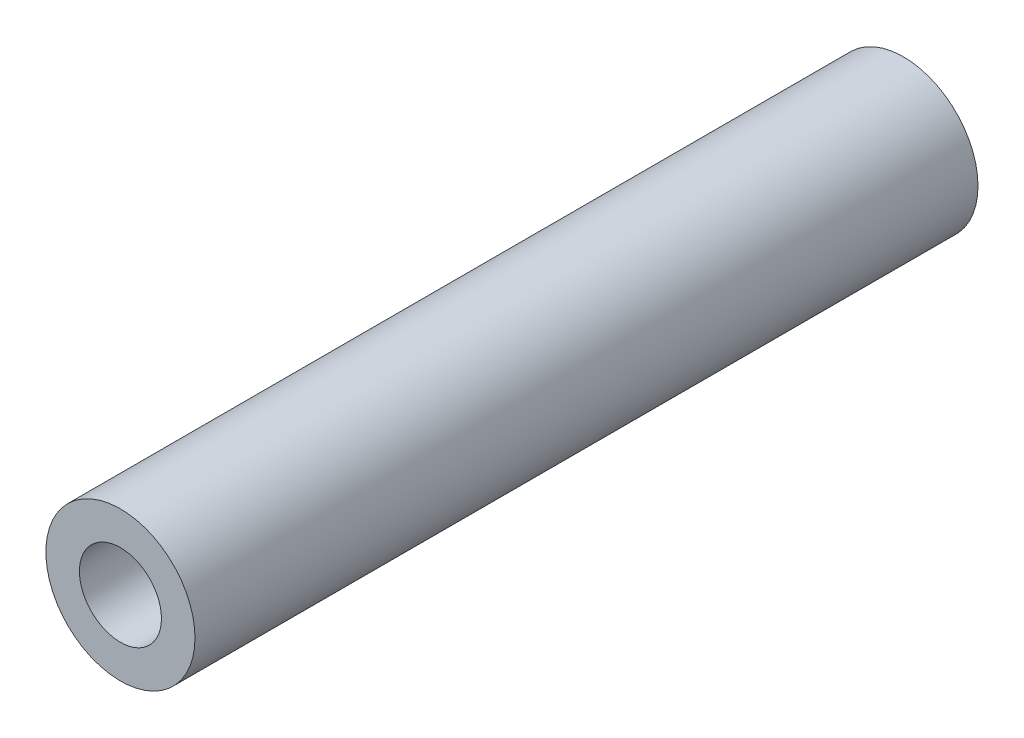
ISO-10303-21;
HEADER;
FILE_DESCRIPTION(('STEP AP214'),'2;1');
FILE_NAME('part.step','',(''),(''),'','','');
FILE_SCHEMA(('AUTOMOTIVE_DESIGN { 1 0 10303 214 1 1 1 1 }'));
ENDSEC;
DATA;
#1=APPLICATION_CONTEXT('core data for automotive mechanical design processes');
#2=APPLICATION_PROTOCOL_DEFINITION('international standard','automotive_design',2000,#1);
#3=PRODUCT_CONTEXT('',#1,'mechanical');
#4=PRODUCT('Part','Part','',(#3));
#5=PRODUCT_RELATED_PRODUCT_CATEGORY('part','',(#4));
#6=PRODUCT_DEFINITION_FORMATION('','',#4);
#7=PRODUCT_DEFINITION_CONTEXT('part definition',#1,'design');
#8=PRODUCT_DEFINITION('design','',#6,#7);
#9=PRODUCT_DEFINITION_SHAPE('','',#8);
#10=(LENGTH_UNIT() NAMED_UNIT(*) SI_UNIT(.MILLI.,.METRE.));
#11=(NAMED_UNIT(*) PLANE_ANGLE_UNIT() SI_UNIT($,.RADIAN.));
#12=(NAMED_UNIT(*) SI_UNIT($,.STERADIAN.) SOLID_ANGLE_UNIT());
#13=UNCERTAINTY_MEASURE_WITH_UNIT(LENGTH_MEASURE(1.E-05),#10,'distance_accuracy_value','');
#14=(GEOMETRIC_REPRESENTATION_CONTEXT(3) GLOBAL_UNCERTAINTY_ASSIGNED_CONTEXT((#13)) GLOBAL_UNIT_ASSIGNED_CONTEXT((#10,
#11,#12)) REPRESENTATION_CONTEXT('',''));
#15=CARTESIAN_POINT('',(0.,0.,0.));
#16=DIRECTION('',(0.,0.,1.));
#17=DIRECTION('',(1.,0.,0.));
#18=AXIS2_PLACEMENT_3D('',#15,#16,#17);
#19=CARTESIAN_POINT('',(0.,0.,31.5));
#20=DIRECTION('',(0.,0.,-1.));
#21=DIRECTION('',(-1.,0.,0.));
#22=AXIS2_PLACEMENT_3D('',#19,#20,#21);
#23=CYLINDRICAL_SURFACE('',#22,3.);
#24=CARTESIAN_POINT('',(0.,0.,31.5));
#25=DIRECTION('',(0.,0.,1.));
#26=DIRECTION('',(1.,0.,0.));
#27=AXIS2_PLACEMENT_3D('',#24,#25,#26);
#28=CIRCLE('',#27,3.);
#29=CARTESIAN_POINT('',(3.,0.,31.5));
#30=VERTEX_POINT('',#29);
#31=EDGE_CURVE('E10',#30,#30,#28,.T.);
#32=ORIENTED_EDGE('',*,*,#31,.F.);
#33=EDGE_LOOP('',(#32));
#34=FACE_BOUND('',#33,.T.);
#35=CARTESIAN_POINT('',(0.,0.,0.));
#36=DIRECTION('',(0.,0.,1.));
#37=DIRECTION('',(1.,0.,0.));
#38=AXIS2_PLACEMENT_3D('',#35,#36,#37);
#39=CIRCLE('',#38,3.);
#40=CARTESIAN_POINT('',(3.,0.,0.));
#41=VERTEX_POINT('',#40);
#42=EDGE_CURVE('E38',#41,#41,#39,.T.);
#43=ORIENTED_EDGE('',*,*,#42,.T.);
#44=EDGE_LOOP('',(#43));
#45=FACE_BOUND('',#44,.T.);
#46=ADVANCED_FACE('F35',(#34,#45),#23,.T.);
#47=CARTESIAN_POINT('',(0.,0.,31.5));
#48=DIRECTION('',(0.,0.,1.));
#49=DIRECTION('',(1.,0.,0.));
#50=AXIS2_PLACEMENT_3D('',#47,#48,#49);
#51=PLANE('',#50);
#52=CARTESIAN_POINT('',(0.,0.,31.5));
#53=DIRECTION('',(0.,0.,1.));
#54=DIRECTION('',(1.,0.,0.));
#55=AXIS2_PLACEMENT_3D('',#52,#53,#54);
#56=CIRCLE('',#55,1.65);
#57=CARTESIAN_POINT('',(1.65,0.,31.5));
#58=VERTEX_POINT('',#57);
#59=EDGE_CURVE('E49',#58,#58,#56,.T.);
#60=ORIENTED_EDGE('',*,*,#59,.F.);
#61=EDGE_LOOP('',(#60));
#62=FACE_BOUND('',#61,.T.);
#63=ORIENTED_EDGE('',*,*,#31,.T.);
#64=EDGE_LOOP('',(#63));
#65=FACE_BOUND('',#64,.T.);
#66=ADVANCED_FACE('F55',(#62,#65),#51,.T.);
#67=CARTESIAN_POINT('',(0.,0.,0.));
#68=DIRECTION('',(0.,0.,1.));
#69=DIRECTION('',(1.,0.,0.));
#70=AXIS2_PLACEMENT_3D('',#67,#68,#69);
#71=PLANE('',#70);
#72=CARTESIAN_POINT('',(0.,0.,0.));
#73=DIRECTION('',(0.,0.,1.));
#74=DIRECTION('',(1.,0.,0.));
#75=AXIS2_PLACEMENT_3D('',#72,#73,#74);
#76=CIRCLE('',#75,1.64999999999999);
#77=CARTESIAN_POINT('',(1.64999999999999,0.,0.));
#78=VERTEX_POINT('',#77);
#79=EDGE_CURVE('E45',#78,#78,#76,.T.);
#80=ORIENTED_EDGE('',*,*,#79,.T.);
#81=EDGE_LOOP('',(#80));
#82=FACE_BOUND('',#81,.T.);
#83=ORIENTED_EDGE('',*,*,#42,.F.);
#84=EDGE_LOOP('',(#83));
#85=FACE_BOUND('',#84,.T.);
#86=ADVANCED_FACE('F57',(#82,#85),#71,.F.);
#87=CARTESIAN_POINT('',(0.,0.,31.5));
#88=DIRECTION('',(0.,0.,1.));
#89=DIRECTION('',(1.,0.,0.));
#90=AXIS2_PLACEMENT_3D('',#87,#88,#89);
#91=CYLINDRICAL_SURFACE('',#90,1.64999999999999);
#92=ORIENTED_EDGE('',*,*,#79,.F.);
#93=EDGE_LOOP('',(#92));
#94=FACE_BOUND('',#93,.T.);
#95=ORIENTED_EDGE('',*,*,#59,.T.);
#96=EDGE_LOOP('',(#95));
#97=FACE_BOUND('',#96,.T.);
#98=ADVANCED_FACE('F53',(#94,#97),#91,.F.);
#99=CLOSED_SHELL('',(#46,#66,#86,#98));
#100=MANIFOLD_SOLID_BREP('B2',#99);
#101=ADVANCED_BREP_SHAPE_REPRESENTATION('',(#18,#100),#14);
#102=SHAPE_DEFINITION_REPRESENTATION(#9,#101);
ENDSEC;
END-ISO-10303-21;
